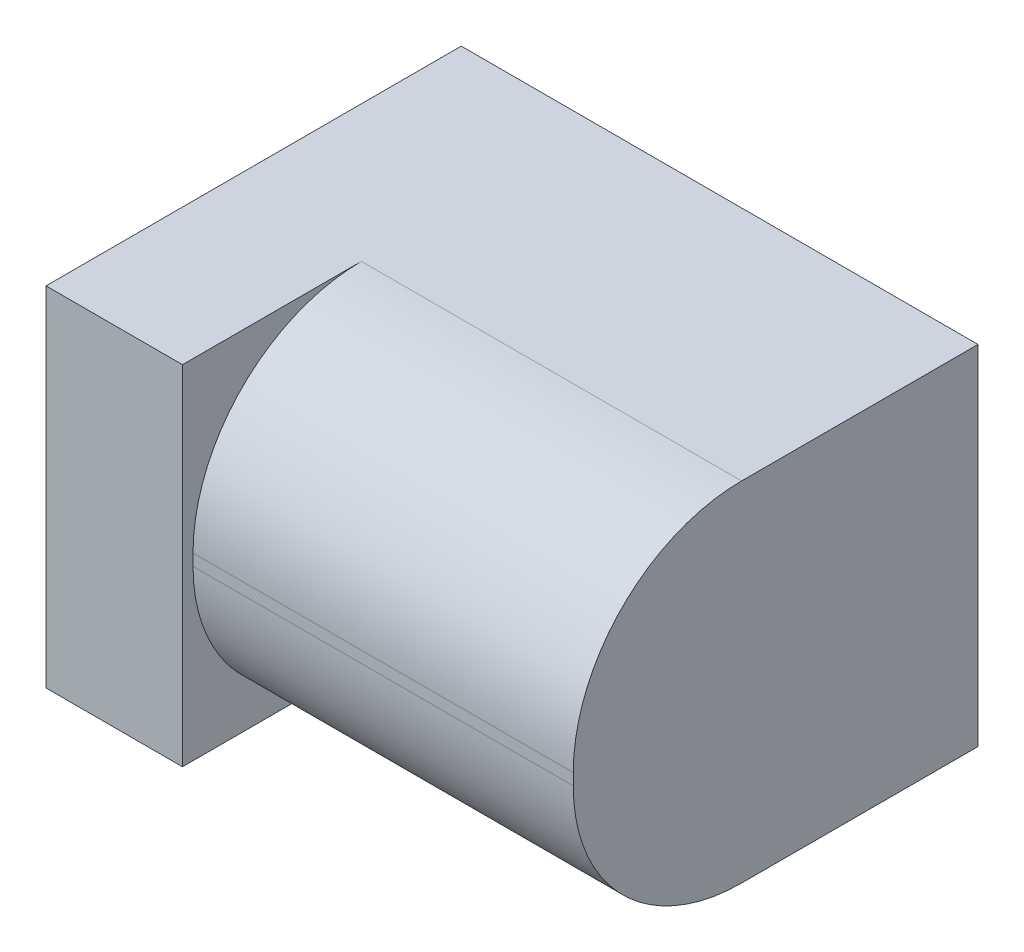
ISO-10303-21;
HEADER;
FILE_DESCRIPTION(('STEP AP214'),'2;1');
FILE_NAME('part.step','',(''),(''),'','','');
FILE_SCHEMA(('AUTOMOTIVE_DESIGN { 1 0 10303 214 1 1 1 1 }'));
ENDSEC;
DATA;
#1=APPLICATION_CONTEXT('core data for automotive mechanical design processes');
#2=APPLICATION_PROTOCOL_DEFINITION('international standard','automotive_design',2000,#1);
#3=PRODUCT_CONTEXT('',#1,'mechanical');
#4=PRODUCT('Part','Part','',(#3));
#5=PRODUCT_RELATED_PRODUCT_CATEGORY('part','',(#4));
#6=PRODUCT_DEFINITION_FORMATION('','',#4);
#7=PRODUCT_DEFINITION_CONTEXT('part definition',#1,'design');
#8=PRODUCT_DEFINITION('design','',#6,#7);
#9=PRODUCT_DEFINITION_SHAPE('','',#8);
#10=(LENGTH_UNIT() NAMED_UNIT(*) SI_UNIT(.MILLI.,.METRE.));
#11=(NAMED_UNIT(*) PLANE_ANGLE_UNIT() SI_UNIT($,.RADIAN.));
#12=(NAMED_UNIT(*) SI_UNIT($,.STERADIAN.) SOLID_ANGLE_UNIT());
#13=UNCERTAINTY_MEASURE_WITH_UNIT(LENGTH_MEASURE(1.E-05),#10,'distance_accuracy_value','');
#14=(GEOMETRIC_REPRESENTATION_CONTEXT(3) GLOBAL_UNCERTAINTY_ASSIGNED_CONTEXT((#13)) GLOBAL_UNIT_ASSIGNED_CONTEXT((#10,
#11,#12)) REPRESENTATION_CONTEXT('',''));
#15=CARTESIAN_POINT('',(0.,0.,0.));
#16=DIRECTION('',(0.,0.,1.));
#17=DIRECTION('',(1.,0.,0.));
#18=AXIS2_PLACEMENT_3D('',#15,#16,#17);
#19=CARTESIAN_POINT('',(149.107021032052,93.3557074721435,1.406131229333));
#20=DIRECTION('',(-1.,0.,0.));
#21=DIRECTION('',(0.,-1.,0.));
#22=AXIS2_PLACEMENT_3D('',#19,#20,#21);
#23=DEGENERATE_TOROIDAL_SURFACE('',#22,0.367752314153989,0.5,.T.);
#24=CARTESIAN_POINT('',(149.107021032052,92.9879551579895,1.406131229333));
#25=DIRECTION('',(0.,0.,1.));
#26=DIRECTION('',(0.,-1.,0.));
#27=AXIS2_PLACEMENT_3D('',#24,#25,#26);
#28=CIRCLE('',#27,0.5);
#29=CARTESIAN_POINT('',(148.607021032052,92.9879551579895,1.406131229333));
#30=VERTEX_POINT('',#29);
#31=CARTESIAN_POINT('',(149.107021032052,92.4879551579895,1.406131229333));
#32=VERTEX_POINT('',#31);
#33=EDGE_CURVE('E212',#30,#32,#28,.T.);
#34=ORIENTED_EDGE('',*,*,#33,.F.);
#35=CARTESIAN_POINT('',(148.607021032052,93.3557074721435,1.406131229333));
#36=DIRECTION('',(-1.,0.,0.));
#37=DIRECTION('',(0.,-1.,0.));
#38=AXIS2_PLACEMENT_3D('',#35,#36,#37);
#39=CIRCLE('',#38,0.367752314153989);
#40=CARTESIAN_POINT('',(148.607021032052,93.7234597862975,1.406131229333));
#41=VERTEX_POINT('',#40);
#42=EDGE_CURVE('E217',#41,#30,#39,.T.);
#43=ORIENTED_EDGE('',*,*,#42,.F.);
#44=CARTESIAN_POINT('',(149.107021032052,93.7234597862975,1.406131229333));
#45=DIRECTION('',(0.,0.,-1.));
#46=DIRECTION('',(0.,1.,0.));
#47=AXIS2_PLACEMENT_3D('',#44,#45,#46);
#48=CIRCLE('',#47,0.5);
#49=CARTESIAN_POINT('',(149.107021032052,94.2234597862975,1.406131229333));
#50=VERTEX_POINT('',#49);
#51=EDGE_CURVE('E264',#41,#50,#48,.T.);
#52=ORIENTED_EDGE('',*,*,#51,.T.);
#53=CARTESIAN_POINT('',(149.107021032052,93.3557074721435,1.406131229333));
#54=DIRECTION('',(-1.,0.,0.));
#55=DIRECTION('',(0.,-1.,0.));
#56=AXIS2_PLACEMENT_3D('',#53,#54,#55);
#57=CIRCLE('',#56,0.867752314153989);
#58=EDGE_CURVE('E268',#50,#32,#57,.T.);
#59=ORIENTED_EDGE('',*,*,#58,.T.);
#60=EDGE_LOOP('',(#34,#43,#52,#59));
#61=FACE_BOUND('',#60,.T.);
#62=ADVANCED_FACE('F40',(#61),#23,.T.);
#63=CARTESIAN_POINT('',(147.207021032052,93.3557074721435,1.406131229333));
#64=DIRECTION('',(-1.,0.,0.));
#65=DIRECTION('',(0.,1.,0.));
#66=AXIS2_PLACEMENT_3D('',#63,#64,#65);
#67=CYLINDRICAL_SURFACE('',#66,3.30484391986099);
#68=DIRECTION('',(-1.,0.,0.));
#69=VECTOR('',#68,1.);
#70=CARTESIAN_POINT('',(147.207021032052,96.6605513920045,1.406131229333));
#71=LINE('',#70,#69);
#72=CARTESIAN_POINT('',(155.307021032052,96.6605513920045,1.406131229333));
#73=VERTEX_POINT('',#72);
#74=CARTESIAN_POINT('',(147.207021032052,96.6605513920045,1.406131229333));
#75=VERTEX_POINT('',#74);
#76=EDGE_CURVE('E284',#73,#75,#71,.T.);
#77=ORIENTED_EDGE('',*,*,#76,.T.);
#78=CARTESIAN_POINT('',(147.207021032052,93.3557074721435,1.406131229333));
#79=DIRECTION('',(-1.,0.,0.));
#80=DIRECTION('',(0.,1.,0.));
#81=AXIS2_PLACEMENT_3D('',#78,#79,#80);
#82=CIRCLE('',#81,3.30484391986099);
#83=CARTESIAN_POINT('',(147.207021032052,90.0508635522826,1.406131229333));
#84=VERTEX_POINT('',#83);
#85=EDGE_CURVE('E263',#75,#84,#82,.T.);
#86=ORIENTED_EDGE('',*,*,#85,.T.);
#87=DIRECTION('',(-1.,0.,0.));
#88=VECTOR('',#87,1.);
#89=CARTESIAN_POINT('',(147.207021032052,90.0508635522826,1.406131229333));
#90=LINE('',#89,#88);
#91=CARTESIAN_POINT('',(155.307021032052,90.0508635522826,1.406131229333));
#92=VERTEX_POINT('',#91);
#93=EDGE_CURVE('E191',#92,#84,#90,.T.);
#94=ORIENTED_EDGE('',*,*,#93,.F.);
#95=CARTESIAN_POINT('',(155.307021032052,93.3557074721435,1.406131229333));
#96=DIRECTION('',(-1.,0.,0.));
#97=DIRECTION('',(0.,1.,0.));
#98=AXIS2_PLACEMENT_3D('',#95,#96,#97);
#99=CIRCLE('',#98,3.30484391986099);
#100=EDGE_CURVE('E253',#73,#92,#99,.T.);
#101=ORIENTED_EDGE('',*,*,#100,.F.);
#102=EDGE_LOOP('',(#77,#86,#94,#101));
#103=FACE_BOUND('',#102,.T.);
#104=ADVANCED_FACE('F42',(#103),#67,.F.);
#105=CARTESIAN_POINT('',(147.207021032052,93.3557074721435,1.406131229333));
#106=DIRECTION('',(-1.,0.,0.));
#107=DIRECTION('',(0.,1.,0.));
#108=AXIS2_PLACEMENT_3D('',#105,#106,#107);
#109=CYLINDRICAL_SURFACE('',#108,0.867752314153989);
#110=DIRECTION('',(-1.,0.,0.));
#111=VECTOR('',#110,1.);
#112=CARTESIAN_POINT('',(147.207021032052,94.2234597862975,1.406131229333));
#113=LINE('',#112,#111);
#114=CARTESIAN_POINT('',(155.307021032052,94.2234597862975,1.406131229333));
#115=VERTEX_POINT('',#114);
#116=EDGE_CURVE('E254',#115,#50,#113,.T.);
#117=ORIENTED_EDGE('',*,*,#116,.F.);
#118=CARTESIAN_POINT('',(155.307021032052,93.3557074721435,1.406131229333));
#119=DIRECTION('',(-1.,0.,0.));
#120=DIRECTION('',(0.,1.,0.));
#121=AXIS2_PLACEMENT_3D('',#118,#119,#120);
#122=CIRCLE('',#121,0.867752314153989);
#123=CARTESIAN_POINT('',(155.307021032052,92.4879551579895,1.406131229333));
#124=VERTEX_POINT('',#123);
#125=EDGE_CURVE('E213',#115,#124,#122,.T.);
#126=ORIENTED_EDGE('',*,*,#125,.T.);
#127=DIRECTION('',(-1.,0.,0.));
#128=VECTOR('',#127,1.);
#129=CARTESIAN_POINT('',(147.207021032052,92.4879551579895,1.406131229333));
#130=LINE('',#129,#128);
#131=EDGE_CURVE('E208',#124,#32,#130,.T.);
#132=ORIENTED_EDGE('',*,*,#131,.T.);
#133=ORIENTED_EDGE('',*,*,#58,.F.);
#134=EDGE_LOOP('',(#117,#126,#132,#133));
#135=FACE_BOUND('',#134,.T.);
#136=ADVANCED_FACE('F361',(#135),#109,.T.);
#137=CARTESIAN_POINT('',(149.107021032052,93.3557074721435,1.406131229333));
#138=DIRECTION('',(-1.,0.,0.));
#139=DIRECTION('',(0.,-1.,0.));
#140=AXIS2_PLACEMENT_3D('',#137,#138,#139);
#141=DEGENERATE_TOROIDAL_SURFACE('',#140,0.367752314153989,0.5,.T.);
#142=CARTESIAN_POINT('',(148.607021032052,93.3557074721435,1.406131229333));
#143=DIRECTION('',(-1.,0.,0.));
#144=DIRECTION('',(0.,-1.,0.));
#145=AXIS2_PLACEMENT_3D('',#142,#143,#144);
#146=CIRCLE('',#145,0.367752314153989);
#147=EDGE_CURVE('E221',#30,#41,#146,.T.);
#148=ORIENTED_EDGE('',*,*,#147,.F.);
#149=ORIENTED_EDGE('',*,*,#33,.T.);
#150=CARTESIAN_POINT('',(149.107021032052,93.3557074721435,1.406131229333));
#151=DIRECTION('',(-1.,0.,0.));
#152=DIRECTION('',(0.,-1.,0.));
#153=AXIS2_PLACEMENT_3D('',#150,#151,#152);
#154=CIRCLE('',#153,0.867752314153989);
#155=EDGE_CURVE('E207',#32,#50,#154,.T.);
#156=ORIENTED_EDGE('',*,*,#155,.T.);
#157=ORIENTED_EDGE('',*,*,#51,.F.);
#158=EDGE_LOOP('',(#148,#149,#156,#157));
#159=FACE_BOUND('',#158,.T.);
#160=ADVANCED_FACE('F371',(#159),#141,.T.);
#161=CARTESIAN_POINT('',(195.23999661698,93.5658453891069,1.29962091738699));
#162=DIRECTION('',(1.,0.,0.));
#163=DIRECTION('',(0.,0.,1.));
#164=AXIS2_PLACEMENT_3D('',#161,#162,#163);
#165=CYLINDRICAL_SURFACE('',#164,4.5);
#166=DIRECTION('',(-1.,0.,0.));
#167=VECTOR('',#166,1.);
#168=CARTESIAN_POINT('',(195.23999661698,93.5658453891069,5.79962091738699));
#169=LINE('',#168,#167);
#170=CARTESIAN_POINT('',(161.019288739785,93.5658453891069,5.79962091738699));
#171=VERTEX_POINT('',#170);
#172=CARTESIAN_POINT('',(150.855523349072,93.5658453891069,5.79962091738699));
#173=VERTEX_POINT('',#172);
#174=EDGE_CURVE('E187',#171,#173,#169,.T.);
#175=ORIENTED_EDGE('',*,*,#174,.F.);
#176=CARTESIAN_POINT('',(161.019288739785,93.5658453891069,1.29962091738699));
#177=DIRECTION('',(1.,0.,0.));
#178=DIRECTION('',(0.,0.,1.));
#179=AXIS2_PLACEMENT_3D('',#176,#177,#178);
#180=CIRCLE('',#179,4.5);
#181=CARTESIAN_POINT('',(161.019288739785,98.0658453891069,1.29962091738699));
#182=VERTEX_POINT('',#181);
#183=EDGE_CURVE('E51',#182,#171,#180,.T.);
#184=ORIENTED_EDGE('',*,*,#183,.F.);
#185=DIRECTION('',(-1.,0.,0.));
#186=VECTOR('',#185,1.);
#187=CARTESIAN_POINT('',(195.23999661698,98.0658453891069,1.29962091738699));
#188=LINE('',#187,#186);
#189=CARTESIAN_POINT('',(150.855523349072,98.0658453891069,1.29962091738699));
#190=VERTEX_POINT('',#189);
#191=EDGE_CURVE('E202',#182,#190,#188,.T.);
#192=ORIENTED_EDGE('',*,*,#191,.T.);
#193=CARTESIAN_POINT('',(150.855523349072,93.5658453891069,1.29962091738699));
#194=DIRECTION('',(1.,0.,0.));
#195=DIRECTION('',(0.,0.,1.));
#196=AXIS2_PLACEMENT_3D('',#193,#194,#195);
#197=CIRCLE('',#196,4.5);
#198=EDGE_CURVE('E206',#190,#173,#197,.T.);
#199=ORIENTED_EDGE('',*,*,#198,.T.);
#200=EDGE_LOOP('',(#175,#184,#192,#199));
#201=FACE_BOUND('',#200,.T.);
#202=ADVANCED_FACE('F382',(#201),#165,.T.);
#203=CARTESIAN_POINT('',(195.23999661698,93.2570854107252,1.29962091738699));
#204=DIRECTION('',(-1.,0.,0.));
#205=DIRECTION('',(0.,0.,-1.));
#206=AXIS2_PLACEMENT_3D('',#203,#204,#205);
#207=CYLINDRICAL_SURFACE('',#206,4.5);
#208=DIRECTION('',(1.,0.,0.));
#209=VECTOR('',#208,1.);
#210=CARTESIAN_POINT('',(195.23999661698,93.2570854107252,5.79962091738699));
#211=LINE('',#210,#209);
#212=CARTESIAN_POINT('',(150.855523349072,93.2570854107252,5.79962091738699));
#213=VERTEX_POINT('',#212);
#214=CARTESIAN_POINT('',(161.019288739785,93.2570854107252,5.79962091738699));
#215=VERTEX_POINT('',#214);
#216=EDGE_CURVE('E178',#213,#215,#211,.T.);
#217=ORIENTED_EDGE('',*,*,#216,.F.);
#218=CARTESIAN_POINT('',(150.855523349072,93.2570854107252,1.29962091738699));
#219=DIRECTION('',(-1.,0.,0.));
#220=DIRECTION('',(0.,0.,-1.));
#221=AXIS2_PLACEMENT_3D('',#218,#219,#220);
#222=CIRCLE('',#221,4.5);
#223=CARTESIAN_POINT('',(150.855523349072,88.7570854107252,1.29962091738699));
#224=VERTEX_POINT('',#223);
#225=EDGE_CURVE('E164',#224,#213,#222,.T.);
#226=ORIENTED_EDGE('',*,*,#225,.F.);
#227=DIRECTION('',(1.,0.,0.));
#228=VECTOR('',#227,1.);
#229=CARTESIAN_POINT('',(195.23999661698,88.7570854107252,1.29962091738699));
#230=LINE('',#229,#228);
#231=CARTESIAN_POINT('',(161.019288739785,88.7570854107252,1.29962091738699));
#232=VERTEX_POINT('',#231);
#233=EDGE_CURVE('E232',#224,#232,#230,.T.);
#234=ORIENTED_EDGE('',*,*,#233,.T.);
#235=CARTESIAN_POINT('',(161.019288739785,93.2570854107252,1.29962091738699));
#236=DIRECTION('',(-1.,0.,0.));
#237=DIRECTION('',(0.,0.,-1.));
#238=AXIS2_PLACEMENT_3D('',#235,#236,#237);
#239=CIRCLE('',#238,4.5);
#240=EDGE_CURVE('E181',#232,#215,#239,.T.);
#241=ORIENTED_EDGE('',*,*,#240,.T.);
#242=EDGE_LOOP('',(#217,#226,#234,#241));
#243=FACE_BOUND('',#242,.T.);
#244=ADVANCED_FACE('F179',(#243),#207,.T.);
#245=CARTESIAN_POINT('',(150.855523349072,56.63326000042,6.33440128136499));
#246=DIRECTION('',(-1.,0.,0.));
#247=DIRECTION('',(0.,0.,1.));
#248=AXIS2_PLACEMENT_3D('',#245,#246,#247);
#249=PLANE('',#248);
#250=DIRECTION('',(0.,0.,1.));
#251=VECTOR('',#250,1.);
#252=CARTESIAN_POINT('',(150.855523349072,98.0658453891069,-5.01892845844));
#253=LINE('',#252,#251);
#254=CARTESIAN_POINT('',(150.855523349072,98.0658453891069,6.08107154156001));
#255=VERTEX_POINT('',#254);
#256=EDGE_CURVE('E222',#190,#255,#253,.T.);
#257=ORIENTED_EDGE('',*,*,#256,.T.);
#258=DIRECTION('',(0.,-1.,0.));
#259=VECTOR('',#258,1.);
#260=CARTESIAN_POINT('',(150.855523349072,85.43350000042,6.08107154156001));
#261=LINE('',#260,#259);
#262=CARTESIAN_POINT('',(150.855523349072,88.7570854107252,6.08107154156001));
#263=VERTEX_POINT('',#262);
#264=EDGE_CURVE('E224',#255,#263,#261,.T.);
#265=ORIENTED_EDGE('',*,*,#264,.T.);
#266=DIRECTION('',(0.,0.,-1.));
#267=VECTOR('',#266,1.);
#268=CARTESIAN_POINT('',(150.855523349072,88.7570854107252,-5.01892845844));
#269=LINE('',#268,#267);
#270=EDGE_CURVE('E172',#263,#224,#269,.T.);
#271=ORIENTED_EDGE('',*,*,#270,.T.);
#272=ORIENTED_EDGE('',*,*,#225,.T.);
#273=DIRECTION('',(0.,1.,0.));
#274=VECTOR('',#273,1.);
#275=CARTESIAN_POINT('',(150.855523349072,56.63326000042,5.79962091738699));
#276=LINE('',#275,#274);
#277=EDGE_CURVE('E169',#213,#173,#276,.T.);
#278=ORIENTED_EDGE('',*,*,#277,.T.);
#279=ORIENTED_EDGE('',*,*,#198,.F.);
#280=EDGE_LOOP('',(#257,#265,#271,#272,#278,#279));
#281=FACE_BOUND('',#280,.T.);
#282=ADVANCED_FACE('F167',(#281),#249,.F.);
#283=CARTESIAN_POINT('',(180.73999661698,85.43350000042,6.08107154156001));
#284=DIRECTION('',(0.,0.,1.));
#285=DIRECTION('',(1.,0.,0.));
#286=AXIS2_PLACEMENT_3D('',#283,#284,#285);
#287=PLANE('',#286);
#288=ORIENTED_EDGE('',*,*,#264,.F.);
#289=DIRECTION('',(1.,0.,0.));
#290=VECTOR('',#289,1.);
#291=CARTESIAN_POINT('',(147.207021032052,98.0658453891069,6.08107154156001));
#292=LINE('',#291,#290);
#293=CARTESIAN_POINT('',(147.207021032052,98.0658453891069,6.08107154156001));
#294=VERTEX_POINT('',#293);
#295=EDGE_CURVE('E245',#294,#255,#292,.T.);
#296=ORIENTED_EDGE('',*,*,#295,.F.);
#297=DIRECTION('',(0.,1.,0.));
#298=VECTOR('',#297,1.);
#299=CARTESIAN_POINT('',(147.207021032052,88.7570854107252,6.08107154156001));
#300=LINE('',#299,#298);
#301=CARTESIAN_POINT('',(147.207021032052,88.7570854107252,6.08107154156001));
#302=VERTEX_POINT('',#301);
#303=EDGE_CURVE('E281',#302,#294,#300,.T.);
#304=ORIENTED_EDGE('',*,*,#303,.F.);
#305=DIRECTION('',(-1.,0.,0.));
#306=VECTOR('',#305,1.);
#307=CARTESIAN_POINT('',(161.519288739785,88.7570854107252,6.08107154156001));
#308=LINE('',#307,#306);
#309=EDGE_CURVE('E240',#263,#302,#308,.T.);
#310=ORIENTED_EDGE('',*,*,#309,.F.);
#311=EDGE_LOOP('',(#288,#296,#304,#310));
#312=FACE_BOUND('',#311,.T.);
#313=ADVANCED_FACE('F412',(#312),#287,.T.);
#314=CARTESIAN_POINT('',(147.207021032052,93.3557074721435,1.406131229333));
#315=DIRECTION('',(-1.,0.,0.));
#316=DIRECTION('',(0.,1.,0.));
#317=AXIS2_PLACEMENT_3D('',#314,#315,#316);
#318=CYLINDRICAL_SURFACE('',#317,3.30484391986099);
#319=CARTESIAN_POINT('',(155.307021032052,93.3557074721435,1.406131229333));
#320=DIRECTION('',(-1.,0.,0.));
#321=DIRECTION('',(0.,1.,0.));
#322=AXIS2_PLACEMENT_3D('',#319,#320,#321);
#323=CIRCLE('',#322,3.30484391986099);
#324=EDGE_CURVE('E249',#92,#73,#323,.T.);
#325=ORIENTED_EDGE('',*,*,#324,.F.);
#326=ORIENTED_EDGE('',*,*,#93,.T.);
#327=CARTESIAN_POINT('',(147.207021032052,93.3557074721435,1.406131229333));
#328=DIRECTION('',(-1.,0.,0.));
#329=DIRECTION('',(0.,1.,0.));
#330=AXIS2_PLACEMENT_3D('',#327,#328,#329);
#331=CIRCLE('',#330,3.30484391986099);
#332=EDGE_CURVE('E196',#84,#75,#331,.T.);
#333=ORIENTED_EDGE('',*,*,#332,.T.);
#334=ORIENTED_EDGE('',*,*,#76,.F.);
#335=EDGE_LOOP('',(#325,#326,#333,#334));
#336=FACE_BOUND('',#335,.T.);
#337=ADVANCED_FACE('F422',(#336),#318,.F.);
#338=CARTESIAN_POINT('',(147.207021032052,93.3557074721435,1.406131229333));
#339=DIRECTION('',(-1.,0.,0.));
#340=DIRECTION('',(0.,1.,0.));
#341=AXIS2_PLACEMENT_3D('',#338,#339,#340);
#342=CYLINDRICAL_SURFACE('',#341,0.867752314153989);
#343=CARTESIAN_POINT('',(155.307021032052,93.3557074721435,1.406131229333));
#344=DIRECTION('',(-1.,0.,0.));
#345=DIRECTION('',(0.,1.,0.));
#346=AXIS2_PLACEMENT_3D('',#343,#344,#345);
#347=CIRCLE('',#346,0.867752314153989);
#348=EDGE_CURVE('E44',#124,#115,#347,.T.);
#349=ORIENTED_EDGE('',*,*,#348,.T.);
#350=ORIENTED_EDGE('',*,*,#116,.T.);
#351=ORIENTED_EDGE('',*,*,#155,.F.);
#352=ORIENTED_EDGE('',*,*,#131,.F.);
#353=EDGE_LOOP('',(#349,#350,#351,#352));
#354=FACE_BOUND('',#353,.T.);
#355=ADVANCED_FACE('F433',(#354),#342,.T.);
#356=CARTESIAN_POINT('',(155.307021032052,95.8473345968991,-0.862389612252399));
#357=DIRECTION('',(-1.,0.,0.));
#358=DIRECTION('',(0.,1.,0.));
#359=AXIS2_PLACEMENT_3D('',#356,#357,#358);
#360=PLANE('',#359);
#361=ORIENTED_EDGE('',*,*,#348,.F.);
#362=ORIENTED_EDGE('',*,*,#125,.F.);
#363=EDGE_LOOP('',(#361,#362));
#364=FACE_BOUND('',#363,.T.);
#365=ORIENTED_EDGE('',*,*,#324,.T.);
#366=ORIENTED_EDGE('',*,*,#100,.T.);
#367=EDGE_LOOP('',(#365,#366));
#368=FACE_BOUND('',#367,.T.);
#369=ADVANCED_FACE('F444',(#364,#368),#360,.T.);
#370=CARTESIAN_POINT('',(148.607021032052,88.7570854107252,-5.01892845844));
#371=DIRECTION('',(-1.,0.,0.));
#372=DIRECTION('',(0.,1.,0.));
#373=AXIS2_PLACEMENT_3D('',#370,#371,#372);
#374=PLANE('',#373);
#375=ORIENTED_EDGE('',*,*,#147,.T.);
#376=ORIENTED_EDGE('',*,*,#42,.T.);
#377=EDGE_LOOP('',(#375,#376));
#378=FACE_BOUND('',#377,.T.);
#379=ADVANCED_FACE('F455',(#378),#374,.T.);
#380=CARTESIAN_POINT('',(147.207021032052,88.7570854107252,-5.01892845844));
#381=DIRECTION('',(-1.,0.,0.));
#382=DIRECTION('',(0.,1.,0.));
#383=AXIS2_PLACEMENT_3D('',#380,#381,#382);
#384=PLANE('',#383);
#385=ORIENTED_EDGE('',*,*,#332,.F.);
#386=ORIENTED_EDGE('',*,*,#85,.F.);
#387=EDGE_LOOP('',(#385,#386));
#388=FACE_BOUND('',#387,.T.);
#389=DIRECTION('',(0.,1.,0.));
#390=VECTOR('',#389,1.);
#391=CARTESIAN_POINT('',(147.207021032052,88.7570854107252,-5.01892845844));
#392=LINE('',#391,#390);
#393=CARTESIAN_POINT('',(147.207021032052,88.7570854107252,-5.01892845844));
#394=VERTEX_POINT('',#393);
#395=CARTESIAN_POINT('',(147.207021032052,98.0658453891069,-5.01892845844));
#396=VERTEX_POINT('',#395);
#397=EDGE_CURVE('E244',#394,#396,#392,.T.);
#398=ORIENTED_EDGE('',*,*,#397,.F.);
#399=DIRECTION('',(0.,0.,1.));
#400=VECTOR('',#399,1.);
#401=CARTESIAN_POINT('',(147.207021032052,88.7570854107252,-5.01892845844));
#402=LINE('',#401,#400);
#403=EDGE_CURVE('E220',#394,#302,#402,.T.);
#404=ORIENTED_EDGE('',*,*,#403,.T.);
#405=ORIENTED_EDGE('',*,*,#303,.T.);
#406=DIRECTION('',(0.,0.,1.));
#407=VECTOR('',#406,1.);
#408=CARTESIAN_POINT('',(147.207021032052,98.0658453891069,-5.01892845844));
#409=LINE('',#408,#407);
#410=EDGE_CURVE('E248',#396,#294,#409,.T.);
#411=ORIENTED_EDGE('',*,*,#410,.F.);
#412=EDGE_LOOP('',(#398,#404,#405,#411));
#413=FACE_BOUND('',#412,.T.);
#414=ADVANCED_FACE('F466',(#388,#413),#384,.T.);
#415=CARTESIAN_POINT('',(150.855523349072,56.63326000042,5.79962091738699));
#416=DIRECTION('',(0.,0.,-1.));
#417=DIRECTION('',(-1.,0.,0.));
#418=AXIS2_PLACEMENT_3D('',#415,#416,#417);
#419=PLANE('',#418);
#420=ORIENTED_EDGE('',*,*,#174,.T.);
#421=ORIENTED_EDGE('',*,*,#277,.F.);
#422=ORIENTED_EDGE('',*,*,#216,.T.);
#423=DIRECTION('',(0.,1.,0.));
#424=VECTOR('',#423,1.);
#425=CARTESIAN_POINT('',(161.019288739785,85.43350000042,5.79962091738699));
#426=LINE('',#425,#424);
#427=EDGE_CURVE('E186',#215,#171,#426,.T.);
#428=ORIENTED_EDGE('',*,*,#427,.T.);
#429=EDGE_LOOP('',(#420,#421,#422,#428));
#430=FACE_BOUND('',#429,.T.);
#431=ADVANCED_FACE('F189',(#430),#419,.F.);
#432=CARTESIAN_POINT('',(147.207021032052,98.0658453891069,-5.01892845844));
#433=DIRECTION('',(0.,1.,0.));
#434=DIRECTION('',(0.,0.,-1.));
#435=AXIS2_PLACEMENT_3D('',#432,#433,#434);
#436=PLANE('',#435);
#437=DIRECTION('',(0.,0.,1.));
#438=VECTOR('',#437,1.);
#439=CARTESIAN_POINT('',(161.019288739785,98.0658453891069,-5.01892845844));
#440=LINE('',#439,#438);
#441=CARTESIAN_POINT('',(161.019288739785,98.0658453891069,-5.01892845844));
#442=VERTEX_POINT('',#441);
#443=EDGE_CURVE('E271',#442,#182,#440,.T.);
#444=ORIENTED_EDGE('',*,*,#443,.F.);
#445=DIRECTION('',(1.,0.,0.));
#446=VECTOR('',#445,1.);
#447=CARTESIAN_POINT('',(147.207021032052,98.0658453891069,-5.01892845844));
#448=LINE('',#447,#446);
#449=EDGE_CURVE('E241',#396,#442,#448,.T.);
#450=ORIENTED_EDGE('',*,*,#449,.F.);
#451=ORIENTED_EDGE('',*,*,#410,.T.);
#452=ORIENTED_EDGE('',*,*,#295,.T.);
#453=ORIENTED_EDGE('',*,*,#256,.F.);
#454=ORIENTED_EDGE('',*,*,#191,.F.);
#455=EDGE_LOOP('',(#444,#450,#451,#452,#453,#454));
#456=FACE_BOUND('',#455,.T.);
#457=ADVANCED_FACE('F487',(#456),#436,.T.);
#458=CARTESIAN_POINT('',(180.73999661698,85.43350000042,-5.01892845844));
#459=DIRECTION('',(0.,0.,1.));
#460=DIRECTION('',(1.,0.,0.));
#461=AXIS2_PLACEMENT_3D('',#458,#459,#460);
#462=PLANE('',#461);
#463=ORIENTED_EDGE('',*,*,#449,.T.);
#464=DIRECTION('',(0.,-1.,0.));
#465=VECTOR('',#464,1.);
#466=CARTESIAN_POINT('',(161.019288739785,85.43350000042,-5.01892845844));
#467=LINE('',#466,#465);
#468=CARTESIAN_POINT('',(161.019288739785,88.7570854107252,-5.01892845844));
#469=VERTEX_POINT('',#468);
#470=EDGE_CURVE('E11',#442,#469,#467,.T.);
#471=ORIENTED_EDGE('',*,*,#470,.T.);
#472=DIRECTION('',(-1.,0.,0.));
#473=VECTOR('',#472,1.);
#474=CARTESIAN_POINT('',(161.519288739785,88.7570854107252,-5.01892845844));
#475=LINE('',#474,#473);
#476=EDGE_CURVE('E62',#469,#394,#475,.T.);
#477=ORIENTED_EDGE('',*,*,#476,.T.);
#478=ORIENTED_EDGE('',*,*,#397,.T.);
#479=EDGE_LOOP('',(#463,#471,#477,#478));
#480=FACE_BOUND('',#479,.T.);
#481=ADVANCED_FACE('F496',(#480),#462,.F.);
#482=CARTESIAN_POINT('',(161.019288739785,88.7570854107252,-5.01892845844));
#483=DIRECTION('',(0.,-1.,0.));
#484=DIRECTION('',(0.,0.,-1.));
#485=AXIS2_PLACEMENT_3D('',#482,#483,#484);
#486=PLANE('',#485);
#487=ORIENTED_EDGE('',*,*,#476,.F.);
#488=DIRECTION('',(0.,0.,1.));
#489=VECTOR('',#488,1.);
#490=CARTESIAN_POINT('',(161.019288739785,88.7570854107252,-5.01892845844));
#491=LINE('',#490,#489);
#492=EDGE_CURVE('E199',#469,#232,#491,.T.);
#493=ORIENTED_EDGE('',*,*,#492,.T.);
#494=ORIENTED_EDGE('',*,*,#233,.F.);
#495=ORIENTED_EDGE('',*,*,#270,.F.);
#496=ORIENTED_EDGE('',*,*,#309,.T.);
#497=ORIENTED_EDGE('',*,*,#403,.F.);
#498=EDGE_LOOP('',(#487,#493,#494,#495,#496,#497));
#499=FACE_BOUND('',#498,.T.);
#500=ADVANCED_FACE('F504',(#499),#486,.T.);
#501=CARTESIAN_POINT('',(161.019288739785,98.0658453891069,-5.01892845844));
#502=DIRECTION('',(1.,0.,0.));
#503=DIRECTION('',(0.,0.,-1.));
#504=AXIS2_PLACEMENT_3D('',#501,#502,#503);
#505=PLANE('',#504);
#506=ORIENTED_EDGE('',*,*,#470,.F.);
#507=ORIENTED_EDGE('',*,*,#443,.T.);
#508=ORIENTED_EDGE('',*,*,#183,.T.);
#509=ORIENTED_EDGE('',*,*,#427,.F.);
#510=ORIENTED_EDGE('',*,*,#240,.F.);
#511=ORIENTED_EDGE('',*,*,#492,.F.);
#512=EDGE_LOOP('',(#506,#507,#508,#509,#510,#511));
#513=FACE_BOUND('',#512,.T.);
#514=ADVANCED_FACE('F510',(#513),#505,.T.);
#515=CLOSED_SHELL('',(#62,#104,#136,#160,#202,#244,#282,#313,#337,#355,#369,#379,#414,#431,#457,
#481,#500,#514));
#516=MANIFOLD_SOLID_BREP('B2',#515);
#517=ADVANCED_BREP_SHAPE_REPRESENTATION('',(#18,#516),#14);
#518=SHAPE_DEFINITION_REPRESENTATION(#9,#517);
ENDSEC;
END-ISO-10303-21;
